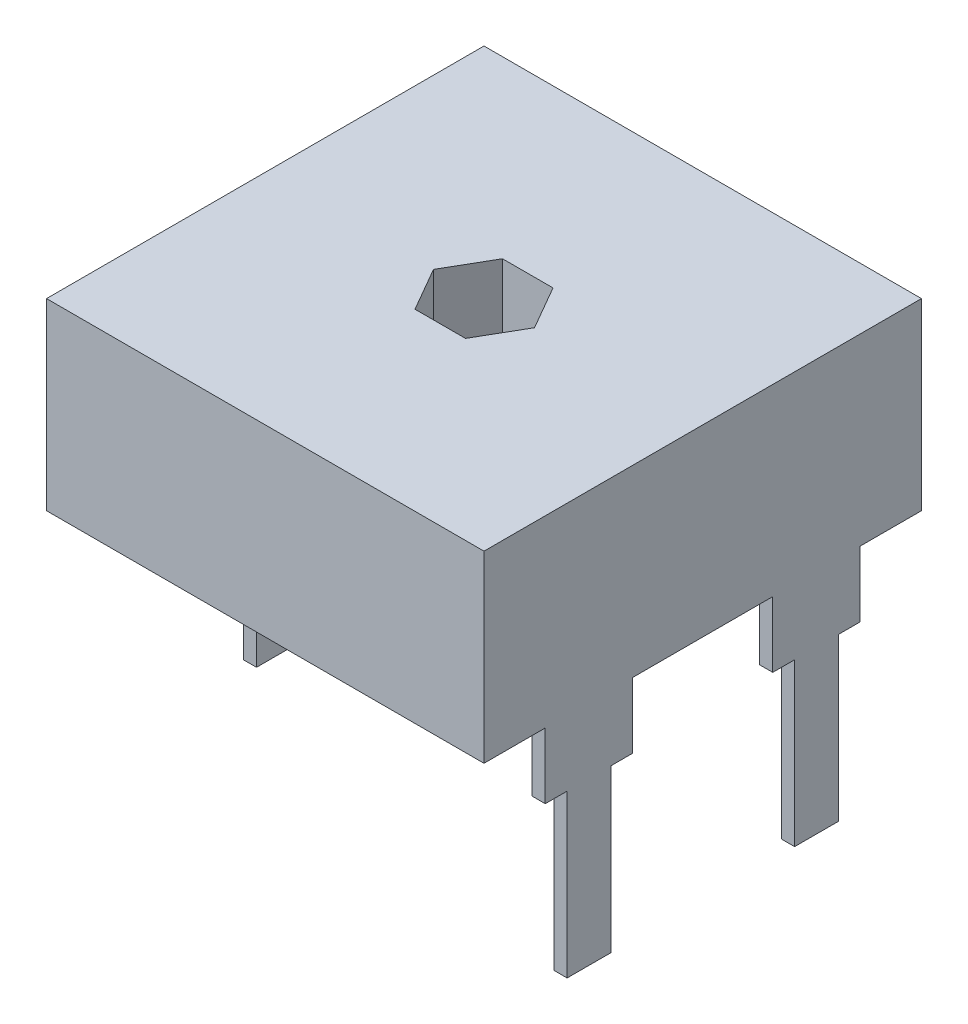
ISO-10303-21;
HEADER;
FILE_DESCRIPTION(('STEP AP214'),'2;1');
FILE_NAME('part.step','',(''),(''),'','','');
FILE_SCHEMA(('AUTOMOTIVE_DESIGN { 1 0 10303 214 1 1 1 1 }'));
ENDSEC;
DATA;
#1=APPLICATION_CONTEXT('core data for automotive mechanical design processes');
#2=APPLICATION_PROTOCOL_DEFINITION('international standard','automotive_design',2000,#1);
#3=PRODUCT_CONTEXT('',#1,'mechanical');
#4=PRODUCT('Part','Part','',(#3));
#5=PRODUCT_RELATED_PRODUCT_CATEGORY('part','',(#4));
#6=PRODUCT_DEFINITION_FORMATION('','',#4);
#7=PRODUCT_DEFINITION_CONTEXT('part definition',#1,'design');
#8=PRODUCT_DEFINITION('design','',#6,#7);
#9=PRODUCT_DEFINITION_SHAPE('','',#8);
#10=(LENGTH_UNIT() NAMED_UNIT(*) SI_UNIT(.MILLI.,.METRE.));
#11=(NAMED_UNIT(*) PLANE_ANGLE_UNIT() SI_UNIT($,.RADIAN.));
#12=(NAMED_UNIT(*) SI_UNIT($,.STERADIAN.) SOLID_ANGLE_UNIT());
#13=UNCERTAINTY_MEASURE_WITH_UNIT(LENGTH_MEASURE(1.E-05),#10,'distance_accuracy_value','');
#14=(GEOMETRIC_REPRESENTATION_CONTEXT(3) GLOBAL_UNCERTAINTY_ASSIGNED_CONTEXT((#13)) GLOBAL_UNIT_ASSIGNED_CONTEXT((#10,
#11,#12)) REPRESENTATION_CONTEXT('',''));
#15=CARTESIAN_POINT('',(0.,0.,0.));
#16=DIRECTION('',(0.,0.,1.));
#17=DIRECTION('',(1.,0.,0.));
#18=AXIS2_PLACEMENT_3D('',#15,#16,#17);
#19=CARTESIAN_POINT('',(0.,-5.7,0.));
#20=DIRECTION('',(0.,-1.,0.));
#21=DIRECTION('',(0.,0.,-1.));
#22=AXIS2_PLACEMENT_3D('',#19,#20,#21);
#23=PLANE('',#22);
#24=DIRECTION('',(-1.,0.,0.));
#25=VECTOR('',#24,1.);
#26=CARTESIAN_POINT('',(-5.,-5.7,0.5));
#27=LINE('',#26,#25);
#28=CARTESIAN_POINT('',(-4.7,-5.7,0.5));
#29=VERTEX_POINT('',#28);
#30=CARTESIAN_POINT('',(-5.,-5.7,0.5));
#31=VERTEX_POINT('',#30);
#32=EDGE_CURVE('E50',#29,#31,#27,.T.);
#33=ORIENTED_EDGE('',*,*,#32,.F.);
#34=DIRECTION('',(0.,0.,1.));
#35=VECTOR('',#34,1.);
#36=CARTESIAN_POINT('',(-4.7,-5.7,1.));
#37=LINE('',#36,#35);
#38=CARTESIAN_POINT('',(-4.7,-5.7,1.));
#39=VERTEX_POINT('',#38);
#40=EDGE_CURVE('E339',#29,#39,#37,.T.);
#41=ORIENTED_EDGE('',*,*,#40,.T.);
#42=DIRECTION('',(-1.,0.,0.));
#43=VECTOR('',#42,1.);
#44=CARTESIAN_POINT('',(-5.,-5.7,1.));
#45=LINE('',#44,#43);
#46=CARTESIAN_POINT('',(-5.,-5.7,1.));
#47=VERTEX_POINT('',#46);
#48=EDGE_CURVE('E342',#39,#47,#45,.T.);
#49=ORIENTED_EDGE('',*,*,#48,.T.);
#50=DIRECTION('',(0.,0.,-1.));
#51=VECTOR('',#50,1.);
#52=CARTESIAN_POINT('',(-5.,-5.7,1.));
#53=LINE('',#52,#51);
#54=EDGE_CURVE('E335',#47,#31,#53,.T.);
#55=ORIENTED_EDGE('',*,*,#54,.T.);
#56=EDGE_LOOP('',(#33,#41,#49,#55));
#57=FACE_BOUND('',#56,.T.);
#58=ADVANCED_FACE('F33',(#57),#23,.T.);
#59=CARTESIAN_POINT('',(0.,-5.7,0.));
#60=DIRECTION('',(0.,-1.,0.));
#61=DIRECTION('',(0.,0.,-1.));
#62=AXIS2_PLACEMENT_3D('',#59,#60,#61);
#63=PLANE('',#62);
#64=DIRECTION('',(0.,0.,1.));
#65=VECTOR('',#64,1.);
#66=CARTESIAN_POINT('',(5.,-5.7,-3.6));
#67=LINE('',#66,#65);
#68=CARTESIAN_POINT('',(5.,-5.7,-3.6));
#69=VERTEX_POINT('',#68);
#70=CARTESIAN_POINT('',(5.,-5.7,-3.1));
#71=VERTEX_POINT('',#70);
#72=EDGE_CURVE('E361',#69,#71,#67,.T.);
#73=ORIENTED_EDGE('',*,*,#72,.T.);
#74=DIRECTION('',(1.,0.,0.));
#75=VECTOR('',#74,1.);
#76=CARTESIAN_POINT('',(4.7,-5.7,-3.1));
#77=LINE('',#76,#75);
#78=CARTESIAN_POINT('',(4.7,-5.7,-3.1));
#79=VERTEX_POINT('',#78);
#80=EDGE_CURVE('E279',#79,#71,#77,.T.);
#81=ORIENTED_EDGE('',*,*,#80,.F.);
#82=DIRECTION('',(0.,0.,-1.));
#83=VECTOR('',#82,1.);
#84=CARTESIAN_POINT('',(4.7,-5.7,-3.6));
#85=LINE('',#84,#83);
#86=CARTESIAN_POINT('',(4.7,-5.7,-3.6));
#87=VERTEX_POINT('',#86);
#88=EDGE_CURVE('E367',#79,#87,#85,.T.);
#89=ORIENTED_EDGE('',*,*,#88,.T.);
#90=DIRECTION('',(1.,0.,0.));
#91=VECTOR('',#90,1.);
#92=CARTESIAN_POINT('',(5.,-5.7,-3.6));
#93=LINE('',#92,#91);
#94=EDGE_CURVE('E371',#87,#69,#93,.T.);
#95=ORIENTED_EDGE('',*,*,#94,.T.);
#96=EDGE_LOOP('',(#73,#81,#89,#95));
#97=FACE_BOUND('',#96,.T.);
#98=ADVANCED_FACE('F582',(#97),#63,.T.);
#99=CARTESIAN_POINT('',(4.7,-5.7,-1.6));
#100=VERTEX_POINT('',#99);
#101=CARTESIAN_POINT('',(4.7,-5.7,-2.1));
#102=VERTEX_POINT('',#101);
#103=EDGE_CURVE('E368',#100,#102,#85,.T.);
#104=ORIENTED_EDGE('',*,*,#103,.T.);
#105=DIRECTION('',(-1.,0.,0.));
#106=VECTOR('',#105,1.);
#107=CARTESIAN_POINT('',(4.7,-5.7,-2.1));
#108=LINE('',#107,#106);
#109=CARTESIAN_POINT('',(5.,-5.7,-2.1));
#110=VERTEX_POINT('',#109);
#111=EDGE_CURVE('E281',#110,#102,#108,.T.);
#112=ORIENTED_EDGE('',*,*,#111,.F.);
#113=CARTESIAN_POINT('',(5.,-5.7,-1.6));
#114=VERTEX_POINT('',#113);
#115=EDGE_CURVE('E365',#110,#114,#67,.T.);
#116=ORIENTED_EDGE('',*,*,#115,.T.);
#117=DIRECTION('',(-1.,0.,0.));
#118=VECTOR('',#117,1.);
#119=CARTESIAN_POINT('',(5.,-5.7,-1.6));
#120=LINE('',#119,#118);
#121=EDGE_CURVE('E364',#114,#100,#120,.T.);
#122=ORIENTED_EDGE('',*,*,#121,.T.);
#123=EDGE_LOOP('',(#104,#112,#116,#122));
#124=FACE_BOUND('',#123,.T.);
#125=ADVANCED_FACE('F567',(#124),#63,.T.);
#126=CARTESIAN_POINT('',(0.,-5.7,0.));
#127=DIRECTION('',(0.,1.,0.));
#128=DIRECTION('',(0.,0.,1.));
#129=AXIS2_PLACEMENT_3D('',#126,#127,#128);
#130=PLANE('',#129);
#131=DIRECTION('',(1.,0.,0.));
#132=VECTOR('',#131,1.);
#133=CARTESIAN_POINT('',(4.7,-5.7,2.1));
#134=LINE('',#133,#132);
#135=CARTESIAN_POINT('',(4.7,-5.7,2.1));
#136=VERTEX_POINT('',#135);
#137=CARTESIAN_POINT('',(5.,-5.7,2.1));
#138=VERTEX_POINT('',#137);
#139=EDGE_CURVE('E307',#136,#138,#134,.T.);
#140=ORIENTED_EDGE('',*,*,#139,.F.);
#141=DIRECTION('',(0.,0.,-1.));
#142=VECTOR('',#141,1.);
#143=CARTESIAN_POINT('',(4.7,-5.7,3.6));
#144=LINE('',#143,#142);
#145=CARTESIAN_POINT('',(4.7,-5.7,1.6));
#146=VERTEX_POINT('',#145);
#147=EDGE_CURVE('E395',#136,#146,#144,.T.);
#148=ORIENTED_EDGE('',*,*,#147,.T.);
#149=DIRECTION('',(1.,0.,0.));
#150=VECTOR('',#149,1.);
#151=CARTESIAN_POINT('',(5.,-5.7,1.6));
#152=LINE('',#151,#150);
#153=CARTESIAN_POINT('',(5.,-5.7,1.6));
#154=VERTEX_POINT('',#153);
#155=EDGE_CURVE('E398',#146,#154,#152,.T.);
#156=ORIENTED_EDGE('',*,*,#155,.T.);
#157=DIRECTION('',(0.,0.,1.));
#158=VECTOR('',#157,1.);
#159=CARTESIAN_POINT('',(5.,-5.7,3.6));
#160=LINE('',#159,#158);
#161=EDGE_CURVE('E390',#154,#138,#160,.T.);
#162=ORIENTED_EDGE('',*,*,#161,.T.);
#163=EDGE_LOOP('',(#140,#148,#156,#162));
#164=FACE_BOUND('',#163,.T.);
#165=ADVANCED_FACE('F544',(#164),#130,.F.);
#166=DIRECTION('',(-1.,0.,0.));
#167=VECTOR('',#166,1.);
#168=CARTESIAN_POINT('',(4.7,-5.7,3.1));
#169=LINE('',#168,#167);
#170=CARTESIAN_POINT('',(5.,-5.7,3.1));
#171=VERTEX_POINT('',#170);
#172=CARTESIAN_POINT('',(4.7,-5.7,3.1));
#173=VERTEX_POINT('',#172);
#174=EDGE_CURVE('E312',#171,#173,#169,.T.);
#175=ORIENTED_EDGE('',*,*,#174,.F.);
#176=CARTESIAN_POINT('',(5.,-5.7,3.6));
#177=VERTEX_POINT('',#176);
#178=EDGE_CURVE('E393',#171,#177,#160,.T.);
#179=ORIENTED_EDGE('',*,*,#178,.T.);
#180=DIRECTION('',(-1.,0.,0.));
#181=VECTOR('',#180,1.);
#182=CARTESIAN_POINT('',(5.,-5.7,3.6));
#183=LINE('',#182,#181);
#184=CARTESIAN_POINT('',(4.7,-5.7,3.6));
#185=VERTEX_POINT('',#184);
#186=EDGE_CURVE('E392',#177,#185,#183,.T.);
#187=ORIENTED_EDGE('',*,*,#186,.T.);
#188=EDGE_CURVE('E396',#185,#173,#144,.T.);
#189=ORIENTED_EDGE('',*,*,#188,.T.);
#190=EDGE_LOOP('',(#175,#179,#187,#189));
#191=FACE_BOUND('',#190,.T.);
#192=ADVANCED_FACE('F528',(#191),#130,.F.);
#193=CARTESIAN_POINT('',(0.,-4.2,0.));
#194=DIRECTION('',(0.,-1.,0.));
#195=DIRECTION('',(0.,0.,-1.));
#196=AXIS2_PLACEMENT_3D('',#193,#194,#195);
#197=PLANE('',#196);
#198=DIRECTION('',(0.5,0.,-0.866025403784439));
#199=VECTOR('',#198,1.);
#200=CARTESIAN_POINT('',(0.577350269189627,-4.2,1.));
#201=LINE('',#200,#199);
#202=CARTESIAN_POINT('',(0.577350269189627,-4.2,1.));
#203=VERTEX_POINT('',#202);
#204=CARTESIAN_POINT('',(1.15470053837925,-4.2,0.));
#205=VERTEX_POINT('',#204);
#206=EDGE_CURVE('E432',#203,#205,#201,.T.);
#207=ORIENTED_EDGE('',*,*,#206,.T.);
#208=DIRECTION('',(-0.5,0.,-0.866025403784439));
#209=VECTOR('',#208,1.);
#210=CARTESIAN_POINT('',(1.15470053837925,-4.2,0.));
#211=LINE('',#210,#209);
#212=CARTESIAN_POINT('',(0.577350269189626,-4.2,-1.));
#213=VERTEX_POINT('',#212);
#214=EDGE_CURVE('E455',#205,#213,#211,.T.);
#215=ORIENTED_EDGE('',*,*,#214,.T.);
#216=DIRECTION('',(-1.,0.,0.));
#217=VECTOR('',#216,1.);
#218=CARTESIAN_POINT('',(0.577350269189626,-4.2,-1.));
#219=LINE('',#218,#217);
#220=CARTESIAN_POINT('',(-0.577350269189626,-4.2,-1.));
#221=VERTEX_POINT('',#220);
#222=EDGE_CURVE('E420',#213,#221,#219,.T.);
#223=ORIENTED_EDGE('',*,*,#222,.T.);
#224=DIRECTION('',(-0.5,0.,0.866025403784439));
#225=VECTOR('',#224,1.);
#226=CARTESIAN_POINT('',(-0.577350269189626,-4.2,-1.));
#227=LINE('',#226,#225);
#228=CARTESIAN_POINT('',(-1.15470053837925,-4.2,0.));
#229=VERTEX_POINT('',#228);
#230=EDGE_CURVE('E423',#221,#229,#227,.T.);
#231=ORIENTED_EDGE('',*,*,#230,.T.);
#232=DIRECTION('',(0.5,0.,0.866025403784439));
#233=VECTOR('',#232,1.);
#234=CARTESIAN_POINT('',(-1.15470053837925,-4.2,0.));
#235=LINE('',#234,#233);
#236=CARTESIAN_POINT('',(-0.577350269189626,-4.2,1.));
#237=VERTEX_POINT('',#236);
#238=EDGE_CURVE('E426',#229,#237,#235,.T.);
#239=ORIENTED_EDGE('',*,*,#238,.T.);
#240=DIRECTION('',(1.,0.,0.));
#241=VECTOR('',#240,1.);
#242=CARTESIAN_POINT('',(-0.577350269189626,-4.2,1.));
#243=LINE('',#242,#241);
#244=EDGE_CURVE('E429',#237,#203,#243,.T.);
#245=ORIENTED_EDGE('',*,*,#244,.T.);
#246=EDGE_LOOP('',(#207,#215,#223,#231,#239,#245));
#247=FACE_BOUND('',#246,.T.);
#248=DIRECTION('',(0.,0.,1.));
#249=VECTOR('',#248,1.);
#250=CARTESIAN_POINT('',(-4.7,-4.2,1.));
#251=LINE('',#250,#249);
#252=CARTESIAN_POINT('',(-4.7,-4.2,-1.));
#253=VERTEX_POINT('',#252);
#254=CARTESIAN_POINT('',(-4.7,-4.2,1.));
#255=VERTEX_POINT('',#254);
#256=EDGE_CURVE('E346',#253,#255,#251,.T.);
#257=ORIENTED_EDGE('',*,*,#256,.F.);
#258=DIRECTION('',(1.,0.,0.));
#259=VECTOR('',#258,1.);
#260=CARTESIAN_POINT('',(-5.,-4.2,-1.));
#261=LINE('',#260,#259);
#262=CARTESIAN_POINT('',(-5.,-4.2,-1.));
#263=VERTEX_POINT('',#262);
#264=EDGE_CURVE('E334',#263,#253,#261,.T.);
#265=ORIENTED_EDGE('',*,*,#264,.F.);
#266=DIRECTION('',(0.,0.,1.));
#267=VECTOR('',#266,1.);
#268=CARTESIAN_POINT('',(-5.,-4.2,5.));
#269=LINE('',#268,#267);
#270=CARTESIAN_POINT('',(-5.,-4.2,-5.));
#271=VERTEX_POINT('',#270);
#272=EDGE_CURVE('E478',#271,#263,#269,.T.);
#273=ORIENTED_EDGE('',*,*,#272,.F.);
#274=DIRECTION('',(-1.,0.,0.));
#275=VECTOR('',#274,1.);
#276=CARTESIAN_POINT('',(-5.,-4.2,-5.));
#277=LINE('',#276,#275);
#278=CARTESIAN_POINT('',(5.,-4.2,-5.));
#279=VERTEX_POINT('',#278);
#280=EDGE_CURVE('E472',#279,#271,#277,.T.);
#281=ORIENTED_EDGE('',*,*,#280,.F.);
#282=DIRECTION('',(0.,0.,-1.));
#283=VECTOR('',#282,1.);
#284=CARTESIAN_POINT('',(5.,-4.2,5.));
#285=LINE('',#284,#283);
#286=CARTESIAN_POINT('',(5.,-4.2,-3.6));
#287=VERTEX_POINT('',#286);
#288=EDGE_CURVE('E474',#287,#279,#285,.T.);
#289=ORIENTED_EDGE('',*,*,#288,.F.);
#290=DIRECTION('',(1.,0.,0.));
#291=VECTOR('',#290,1.);
#292=CARTESIAN_POINT('',(5.,-4.2,-3.6));
#293=LINE('',#292,#291);
#294=CARTESIAN_POINT('',(4.7,-4.2,-3.6));
#295=VERTEX_POINT('',#294);
#296=EDGE_CURVE('E378',#295,#287,#293,.T.);
#297=ORIENTED_EDGE('',*,*,#296,.F.);
#298=DIRECTION('',(0.,0.,-1.));
#299=VECTOR('',#298,1.);
#300=CARTESIAN_POINT('',(4.7,-4.2,-3.6));
#301=LINE('',#300,#299);
#302=CARTESIAN_POINT('',(4.7,-4.2,-1.6));
#303=VERTEX_POINT('',#302);
#304=EDGE_CURVE('E375',#303,#295,#301,.T.);
#305=ORIENTED_EDGE('',*,*,#304,.F.);
#306=DIRECTION('',(-1.,0.,0.));
#307=VECTOR('',#306,1.);
#308=CARTESIAN_POINT('',(5.,-4.2,-1.6));
#309=LINE('',#308,#307);
#310=CARTESIAN_POINT('',(5.,-4.2,-1.6));
#311=VERTEX_POINT('',#310);
#312=EDGE_CURVE('E360',#311,#303,#309,.T.);
#313=ORIENTED_EDGE('',*,*,#312,.F.);
#314=CARTESIAN_POINT('',(5.,-4.2,1.6));
#315=VERTEX_POINT('',#314);
#316=EDGE_CURVE('E473',#315,#311,#285,.T.);
#317=ORIENTED_EDGE('',*,*,#316,.F.);
#318=DIRECTION('',(1.,0.,0.));
#319=VECTOR('',#318,1.);
#320=CARTESIAN_POINT('',(5.,-4.2,1.6));
#321=LINE('',#320,#319);
#322=CARTESIAN_POINT('',(4.7,-4.2,1.6));
#323=VERTEX_POINT('',#322);
#324=EDGE_CURVE('E406',#323,#315,#321,.T.);
#325=ORIENTED_EDGE('',*,*,#324,.F.);
#326=DIRECTION('',(0.,0.,-1.));
#327=VECTOR('',#326,1.);
#328=CARTESIAN_POINT('',(4.7,-4.2,3.6));
#329=LINE('',#328,#327);
#330=CARTESIAN_POINT('',(4.7,-4.2,3.6));
#331=VERTEX_POINT('',#330);
#332=EDGE_CURVE('E403',#331,#323,#329,.T.);
#333=ORIENTED_EDGE('',*,*,#332,.F.);
#334=DIRECTION('',(-1.,0.,0.));
#335=VECTOR('',#334,1.);
#336=CARTESIAN_POINT('',(5.,-4.2,3.6));
#337=LINE('',#336,#335);
#338=CARTESIAN_POINT('',(5.,-4.2,3.6));
#339=VERTEX_POINT('',#338);
#340=EDGE_CURVE('E389',#339,#331,#337,.T.);
#341=ORIENTED_EDGE('',*,*,#340,.F.);
#342=CARTESIAN_POINT('',(5.,-4.2,5.));
#343=VERTEX_POINT('',#342);
#344=EDGE_CURVE('E469',#343,#339,#285,.T.);
#345=ORIENTED_EDGE('',*,*,#344,.F.);
#346=DIRECTION('',(1.,0.,0.));
#347=VECTOR('',#346,1.);
#348=CARTESIAN_POINT('',(-5.,-4.2,5.));
#349=LINE('',#348,#347);
#350=CARTESIAN_POINT('',(-5.,-4.2,5.));
#351=VERTEX_POINT('',#350);
#352=EDGE_CURVE('E481',#351,#343,#349,.T.);
#353=ORIENTED_EDGE('',*,*,#352,.F.);
#354=CARTESIAN_POINT('',(-5.,-4.2,1.));
#355=VERTEX_POINT('',#354);
#356=EDGE_CURVE('E477',#355,#351,#269,.T.);
#357=ORIENTED_EDGE('',*,*,#356,.F.);
#358=DIRECTION('',(-1.,0.,0.));
#359=VECTOR('',#358,1.);
#360=CARTESIAN_POINT('',(-5.,-4.2,1.));
#361=LINE('',#360,#359);
#362=EDGE_CURVE('E348',#255,#355,#361,.T.);
#363=ORIENTED_EDGE('',*,*,#362,.F.);
#364=EDGE_LOOP('',(#257,#265,#273,#281,#289,#297,#305,#313,#317,#325,#333,#341,#345,#353,#357,#363));
#365=FACE_BOUND('',#364,.T.);
#366=ADVANCED_FACE('F515',(#247,#365),#197,.T.);
#367=CARTESIAN_POINT('',(5.,-4.2,5.));
#368=DIRECTION('',(1.,0.,0.));
#369=DIRECTION('',(0.,0.,-1.));
#370=AXIS2_PLACEMENT_3D('',#367,#368,#369);
#371=PLANE('',#370);
#372=DIRECTION('',(0.,0.,-1.));
#373=VECTOR('',#372,1.);
#374=CARTESIAN_POINT('',(5.,0.,5.));
#375=LINE('',#374,#373);
#376=CARTESIAN_POINT('',(5.,0.,5.));
#377=VERTEX_POINT('',#376);
#378=CARTESIAN_POINT('',(5.,0.,-5.));
#379=VERTEX_POINT('',#378);
#380=EDGE_CURVE('E468',#377,#379,#375,.T.);
#381=ORIENTED_EDGE('',*,*,#380,.F.);
#382=DIRECTION('',(0.,1.,0.));
#383=VECTOR('',#382,1.);
#384=CARTESIAN_POINT('',(5.,-4.2,5.));
#385=LINE('',#384,#383);
#386=EDGE_CURVE('E11',#343,#377,#385,.T.);
#387=ORIENTED_EDGE('',*,*,#386,.F.);
#388=ORIENTED_EDGE('',*,*,#344,.T.);
#389=DIRECTION('',(0.,1.,0.));
#390=VECTOR('',#389,1.);
#391=CARTESIAN_POINT('',(5.,-5.7,3.6));
#392=LINE('',#391,#390);
#393=EDGE_CURVE('E417',#177,#339,#392,.T.);
#394=ORIENTED_EDGE('',*,*,#393,.F.);
#395=ORIENTED_EDGE('',*,*,#178,.F.);
#396=DIRECTION('',(0.,1.,0.));
#397=VECTOR('',#396,1.);
#398=CARTESIAN_POINT('',(5.,-9.4,3.1));
#399=LINE('',#398,#397);
#400=CARTESIAN_POINT('',(5.,-9.4,3.1));
#401=VERTEX_POINT('',#400);
#402=EDGE_CURVE('E325',#401,#171,#399,.T.);
#403=ORIENTED_EDGE('',*,*,#402,.F.);
#404=DIRECTION('',(0.,0.,1.));
#405=VECTOR('',#404,1.);
#406=CARTESIAN_POINT('',(5.,-9.4,2.1));
#407=LINE('',#406,#405);
#408=CARTESIAN_POINT('',(5.,-9.4,2.1));
#409=VERTEX_POINT('',#408);
#410=EDGE_CURVE('E314',#409,#401,#407,.T.);
#411=ORIENTED_EDGE('',*,*,#410,.F.);
#412=DIRECTION('',(0.,1.,0.));
#413=VECTOR('',#412,1.);
#414=CARTESIAN_POINT('',(5.,-9.4,2.1));
#415=LINE('',#414,#413);
#416=EDGE_CURVE('E328',#409,#138,#415,.T.);
#417=ORIENTED_EDGE('',*,*,#416,.T.);
#418=ORIENTED_EDGE('',*,*,#161,.F.);
#419=DIRECTION('',(0.,1.,0.));
#420=VECTOR('',#419,1.);
#421=CARTESIAN_POINT('',(5.,-5.7,1.6));
#422=LINE('',#421,#420);
#423=EDGE_CURVE('E400',#154,#315,#422,.T.);
#424=ORIENTED_EDGE('',*,*,#423,.T.);
#425=ORIENTED_EDGE('',*,*,#316,.T.);
#426=DIRECTION('',(0.,1.,0.));
#427=VECTOR('',#426,1.);
#428=CARTESIAN_POINT('',(5.,-5.7,-1.6));
#429=LINE('',#428,#427);
#430=EDGE_CURVE('E387',#114,#311,#429,.T.);
#431=ORIENTED_EDGE('',*,*,#430,.F.);
#432=ORIENTED_EDGE('',*,*,#115,.F.);
#433=DIRECTION('',(0.,1.,0.));
#434=VECTOR('',#433,1.);
#435=CARTESIAN_POINT('',(5.,-9.4,-2.1));
#436=LINE('',#435,#434);
#437=CARTESIAN_POINT('',(5.,-9.4,-2.1));
#438=VERTEX_POINT('',#437);
#439=EDGE_CURVE('E300',#438,#110,#436,.T.);
#440=ORIENTED_EDGE('',*,*,#439,.F.);
#441=DIRECTION('',(0.,0.,1.));
#442=VECTOR('',#441,1.);
#443=CARTESIAN_POINT('',(5.,-9.4,-3.1));
#444=LINE('',#443,#442);
#445=CARTESIAN_POINT('',(5.,-9.4,-3.1));
#446=VERTEX_POINT('',#445);
#447=EDGE_CURVE('E292',#446,#438,#444,.T.);
#448=ORIENTED_EDGE('',*,*,#447,.F.);
#449=DIRECTION('',(0.,1.,0.));
#450=VECTOR('',#449,1.);
#451=CARTESIAN_POINT('',(5.,-9.4,-3.1));
#452=LINE('',#451,#450);
#453=EDGE_CURVE('E302',#446,#71,#452,.T.);
#454=ORIENTED_EDGE('',*,*,#453,.T.);
#455=ORIENTED_EDGE('',*,*,#72,.F.);
#456=DIRECTION('',(0.,1.,0.));
#457=VECTOR('',#456,1.);
#458=CARTESIAN_POINT('',(5.,-5.7,-3.6));
#459=LINE('',#458,#457);
#460=EDGE_CURVE('E373',#69,#287,#459,.T.);
#461=ORIENTED_EDGE('',*,*,#460,.T.);
#462=ORIENTED_EDGE('',*,*,#288,.T.);
#463=DIRECTION('',(0.,1.,0.));
#464=VECTOR('',#463,1.);
#465=CARTESIAN_POINT('',(5.,-4.2,-5.));
#466=LINE('',#465,#464);
#467=EDGE_CURVE('E37',#279,#379,#466,.T.);
#468=ORIENTED_EDGE('',*,*,#467,.T.);
#469=EDGE_LOOP('',(#381,#387,#388,#394,#395,#403,#411,#417,#418,#424,#425,#431,#432,#440,#448,
#454,#455,#461,#462,#468));
#470=FACE_BOUND('',#469,.T.);
#471=ADVANCED_FACE('F35',(#470),#371,.T.);
#472=CARTESIAN_POINT('',(-5.,-4.2,5.));
#473=DIRECTION('',(0.,0.,1.));
#474=DIRECTION('',(1.,0.,0.));
#475=AXIS2_PLACEMENT_3D('',#472,#473,#474);
#476=PLANE('',#475);
#477=DIRECTION('',(1.,0.,0.));
#478=VECTOR('',#477,1.);
#479=CARTESIAN_POINT('',(-5.,0.,5.));
#480=LINE('',#479,#478);
#481=CARTESIAN_POINT('',(-5.,0.,5.));
#482=VERTEX_POINT('',#481);
#483=EDGE_CURVE('E492',#482,#377,#480,.T.);
#484=ORIENTED_EDGE('',*,*,#483,.F.);
#485=DIRECTION('',(0.,1.,0.));
#486=VECTOR('',#485,1.);
#487=CARTESIAN_POINT('',(-5.,-4.2,5.));
#488=LINE('',#487,#486);
#489=EDGE_CURVE('E42',#351,#482,#488,.T.);
#490=ORIENTED_EDGE('',*,*,#489,.F.);
#491=ORIENTED_EDGE('',*,*,#352,.T.);
#492=ORIENTED_EDGE('',*,*,#386,.T.);
#493=EDGE_LOOP('',(#484,#490,#491,#492));
#494=FACE_BOUND('',#493,.T.);
#495=ADVANCED_FACE('F509',(#494),#476,.T.);
#496=CARTESIAN_POINT('',(-5.,-4.2,5.));
#497=DIRECTION('',(-1.,0.,0.));
#498=DIRECTION('',(0.,0.,1.));
#499=AXIS2_PLACEMENT_3D('',#496,#497,#498);
#500=PLANE('',#499);
#501=DIRECTION('',(0.,0.,1.));
#502=VECTOR('',#501,1.);
#503=CARTESIAN_POINT('',(-5.,0.,5.));
#504=LINE('',#503,#502);
#505=CARTESIAN_POINT('',(-5.,0.,-5.));
#506=VERTEX_POINT('',#505);
#507=EDGE_CURVE('E489',#506,#482,#504,.T.);
#508=ORIENTED_EDGE('',*,*,#507,.F.);
#509=DIRECTION('',(0.,1.,0.));
#510=VECTOR('',#509,1.);
#511=CARTESIAN_POINT('',(-5.,-4.2,-5.));
#512=LINE('',#511,#510);
#513=EDGE_CURVE('E495',#271,#506,#512,.T.);
#514=ORIENTED_EDGE('',*,*,#513,.F.);
#515=ORIENTED_EDGE('',*,*,#272,.T.);
#516=DIRECTION('',(0.,1.,0.));
#517=VECTOR('',#516,1.);
#518=CARTESIAN_POINT('',(-5.,-5.7,-1.));
#519=LINE('',#518,#517);
#520=CARTESIAN_POINT('',(-5.,-5.7,-1.));
#521=VERTEX_POINT('',#520);
#522=EDGE_CURVE('E358',#521,#263,#519,.T.);
#523=ORIENTED_EDGE('',*,*,#522,.F.);
#524=CARTESIAN_POINT('',(-5.,-5.7,-0.5));
#525=VERTEX_POINT('',#524);
#526=EDGE_CURVE('E278',#525,#521,#53,.T.);
#527=ORIENTED_EDGE('',*,*,#526,.F.);
#528=DIRECTION('',(0.,1.,0.));
#529=VECTOR('',#528,1.);
#530=CARTESIAN_POINT('',(-5.,-9.4,-0.5));
#531=LINE('',#530,#529);
#532=CARTESIAN_POINT('',(-5.,-9.4,-0.5));
#533=VERTEX_POINT('',#532);
#534=EDGE_CURVE('E259',#533,#525,#531,.T.);
#535=ORIENTED_EDGE('',*,*,#534,.F.);
#536=DIRECTION('',(0.,0.,-1.));
#537=VECTOR('',#536,1.);
#538=CARTESIAN_POINT('',(-5.,-9.4,-0.5));
#539=LINE('',#538,#537);
#540=CARTESIAN_POINT('',(-5.,-9.4,0.5));
#541=VERTEX_POINT('',#540);
#542=EDGE_CURVE('E265',#541,#533,#539,.T.);
#543=ORIENTED_EDGE('',*,*,#542,.F.);
#544=DIRECTION('',(0.,1.,0.));
#545=VECTOR('',#544,1.);
#546=CARTESIAN_POINT('',(-5.,-9.4,0.5));
#547=LINE('',#546,#545);
#548=EDGE_CURVE('E609',#541,#31,#547,.T.);
#549=ORIENTED_EDGE('',*,*,#548,.T.);
#550=ORIENTED_EDGE('',*,*,#54,.F.);
#551=DIRECTION('',(0.,1.,0.));
#552=VECTOR('',#551,1.);
#553=CARTESIAN_POINT('',(-5.,-5.7,1.));
#554=LINE('',#553,#552);
#555=EDGE_CURVE('E344',#47,#355,#554,.T.);
#556=ORIENTED_EDGE('',*,*,#555,.T.);
#557=ORIENTED_EDGE('',*,*,#356,.T.);
#558=ORIENTED_EDGE('',*,*,#489,.T.);
#559=EDGE_LOOP('',(#508,#514,#515,#523,#527,#535,#543,#549,#550,#556,#557,#558));
#560=FACE_BOUND('',#559,.T.);
#561=ADVANCED_FACE('F276',(#560),#500,.T.);
#562=CARTESIAN_POINT('',(-5.,-4.2,-5.));
#563=DIRECTION('',(0.,0.,-1.));
#564=DIRECTION('',(-1.,0.,0.));
#565=AXIS2_PLACEMENT_3D('',#562,#563,#564);
#566=PLANE('',#565);
#567=DIRECTION('',(-1.,0.,0.));
#568=VECTOR('',#567,1.);
#569=CARTESIAN_POINT('',(-5.,0.,-5.));
#570=LINE('',#569,#568);
#571=EDGE_CURVE('E486',#379,#506,#570,.T.);
#572=ORIENTED_EDGE('',*,*,#571,.F.);
#573=ORIENTED_EDGE('',*,*,#467,.F.);
#574=ORIENTED_EDGE('',*,*,#280,.T.);
#575=ORIENTED_EDGE('',*,*,#513,.T.);
#576=EDGE_LOOP('',(#572,#573,#574,#575));
#577=FACE_BOUND('',#576,.T.);
#578=ADVANCED_FACE('F503',(#577),#566,.T.);
#579=CARTESIAN_POINT('',(0.,0.,0.));
#580=DIRECTION('',(0.,-1.,0.));
#581=DIRECTION('',(0.,0.,-1.));
#582=AXIS2_PLACEMENT_3D('',#579,#580,#581);
#583=PLANE('',#582);
#584=DIRECTION('',(-0.5,0.,-0.866025403784438));
#585=VECTOR('',#584,1.);
#586=CARTESIAN_POINT('',(1.15470053837925,0.,0.));
#587=LINE('',#586,#585);
#588=CARTESIAN_POINT('',(1.15470053837925,0.,0.));
#589=VERTEX_POINT('',#588);
#590=CARTESIAN_POINT('',(0.577350269189626,0.,-1.));
#591=VERTEX_POINT('',#590);
#592=EDGE_CURVE('E437',#589,#591,#587,.T.);
#593=ORIENTED_EDGE('',*,*,#592,.F.);
#594=DIRECTION('',(0.5,0.,-0.866025403784438));
#595=VECTOR('',#594,1.);
#596=CARTESIAN_POINT('',(0.577350269189627,0.,1.));
#597=LINE('',#596,#595);
#598=CARTESIAN_POINT('',(0.577350269189627,0.,1.));
#599=VERTEX_POINT('',#598);
#600=EDGE_CURVE('E435',#599,#589,#597,.T.);
#601=ORIENTED_EDGE('',*,*,#600,.F.);
#602=DIRECTION('',(1.,0.,0.));
#603=VECTOR('',#602,1.);
#604=CARTESIAN_POINT('',(-0.577350269189626,0.,1.));
#605=LINE('',#604,#603);
#606=CARTESIAN_POINT('',(-0.577350269189626,0.,1.));
#607=VERTEX_POINT('',#606);
#608=EDGE_CURVE('E449',#607,#599,#605,.T.);
#609=ORIENTED_EDGE('',*,*,#608,.F.);
#610=DIRECTION('',(0.5,0.,0.866025403784438));
#611=VECTOR('',#610,1.);
#612=CARTESIAN_POINT('',(-1.15470053837925,0.,0.));
#613=LINE('',#612,#611);
#614=CARTESIAN_POINT('',(-1.15470053837925,0.,0.));
#615=VERTEX_POINT('',#614);
#616=EDGE_CURVE('E446',#615,#607,#613,.T.);
#617=ORIENTED_EDGE('',*,*,#616,.F.);
#618=DIRECTION('',(-0.5,0.,0.866025403784439));
#619=VECTOR('',#618,1.);
#620=CARTESIAN_POINT('',(-0.577350269189626,0.,-1.));
#621=LINE('',#620,#619);
#622=CARTESIAN_POINT('',(-0.577350269189626,0.,-1.));
#623=VERTEX_POINT('',#622);
#624=EDGE_CURVE('E443',#623,#615,#621,.T.);
#625=ORIENTED_EDGE('',*,*,#624,.F.);
#626=DIRECTION('',(-1.,0.,0.));
#627=VECTOR('',#626,1.);
#628=CARTESIAN_POINT('',(0.577350269189626,0.,-1.));
#629=LINE('',#628,#627);
#630=EDGE_CURVE('E440',#591,#623,#629,.T.);
#631=ORIENTED_EDGE('',*,*,#630,.F.);
#632=EDGE_LOOP('',(#593,#601,#609,#617,#625,#631));
#633=FACE_BOUND('',#632,.T.);
#634=ORIENTED_EDGE('',*,*,#380,.T.);
#635=ORIENTED_EDGE('',*,*,#571,.T.);
#636=ORIENTED_EDGE('',*,*,#507,.T.);
#637=ORIENTED_EDGE('',*,*,#483,.T.);
#638=EDGE_LOOP('',(#634,#635,#636,#637));
#639=FACE_BOUND('',#638,.T.);
#640=ADVANCED_FACE('F505',(#633,#639),#583,.F.);
#641=CARTESIAN_POINT('',(0.577350269189627,-4.201,1.));
#642=DIRECTION('',(0.866025403784439,0.,0.5));
#643=DIRECTION('',(0.5,0.,-0.866025403784439));
#644=AXIS2_PLACEMENT_3D('',#641,#642,#643);
#645=PLANE('',#644);
#646=DIRECTION('',(0.,1.,0.));
#647=VECTOR('',#646,1.);
#648=CARTESIAN_POINT('',(0.577350269189627,-4.201,1.));
#649=LINE('',#648,#647);
#650=EDGE_CURVE('E453',#203,#599,#649,.T.);
#651=ORIENTED_EDGE('',*,*,#650,.T.);
#652=ORIENTED_EDGE('',*,*,#600,.T.);
#653=DIRECTION('',(0.,1.,0.));
#654=VECTOR('',#653,1.);
#655=CARTESIAN_POINT('',(1.15470053837925,-4.201,0.));
#656=LINE('',#655,#654);
#657=EDGE_CURVE('E452',#205,#589,#656,.T.);
#658=ORIENTED_EDGE('',*,*,#657,.F.);
#659=ORIENTED_EDGE('',*,*,#206,.F.);
#660=EDGE_LOOP('',(#651,#652,#658,#659));
#661=FACE_BOUND('',#660,.T.);
#662=ADVANCED_FACE('F654',(#661),#645,.F.);
#663=CARTESIAN_POINT('',(-0.577350269189626,-4.201,1.));
#664=DIRECTION('',(0.,0.,1.));
#665=DIRECTION('',(1.,0.,0.));
#666=AXIS2_PLACEMENT_3D('',#663,#664,#665);
#667=PLANE('',#666);
#668=DIRECTION('',(0.,1.,0.));
#669=VECTOR('',#668,1.);
#670=CARTESIAN_POINT('',(-0.577350269189626,-4.201,1.));
#671=LINE('',#670,#669);
#672=EDGE_CURVE('E456',#237,#607,#671,.T.);
#673=ORIENTED_EDGE('',*,*,#672,.T.);
#674=ORIENTED_EDGE('',*,*,#608,.T.);
#675=ORIENTED_EDGE('',*,*,#650,.F.);
#676=ORIENTED_EDGE('',*,*,#244,.F.);
#677=EDGE_LOOP('',(#673,#674,#675,#676));
#678=FACE_BOUND('',#677,.T.);
#679=ADVANCED_FACE('F650',(#678),#667,.F.);
#680=CARTESIAN_POINT('',(-1.15470053837925,-4.201,0.));
#681=DIRECTION('',(-0.866025403784438,0.,0.5));
#682=DIRECTION('',(0.5,0.,0.866025403784439));
#683=AXIS2_PLACEMENT_3D('',#680,#681,#682);
#684=PLANE('',#683);
#685=DIRECTION('',(0.,1.,0.));
#686=VECTOR('',#685,1.);
#687=CARTESIAN_POINT('',(-1.15470053837925,-4.201,0.));
#688=LINE('',#687,#686);
#689=EDGE_CURVE('E458',#229,#615,#688,.T.);
#690=ORIENTED_EDGE('',*,*,#689,.T.);
#691=ORIENTED_EDGE('',*,*,#616,.T.);
#692=ORIENTED_EDGE('',*,*,#672,.F.);
#693=ORIENTED_EDGE('',*,*,#238,.F.);
#694=EDGE_LOOP('',(#690,#691,#692,#693));
#695=FACE_BOUND('',#694,.T.);
#696=ADVANCED_FACE('F653',(#695),#684,.F.);
#697=CARTESIAN_POINT('',(-0.577350269189626,-4.201,-1.));
#698=DIRECTION('',(-0.866025403784439,0.,-0.5));
#699=DIRECTION('',(-0.5,0.,0.866025403784439));
#700=AXIS2_PLACEMENT_3D('',#697,#698,#699);
#701=PLANE('',#700);
#702=DIRECTION('',(0.,1.,0.));
#703=VECTOR('',#702,1.);
#704=CARTESIAN_POINT('',(-0.577350269189626,-4.201,-1.));
#705=LINE('',#704,#703);
#706=EDGE_CURVE('E460',#221,#623,#705,.T.);
#707=ORIENTED_EDGE('',*,*,#706,.T.);
#708=ORIENTED_EDGE('',*,*,#624,.T.);
#709=ORIENTED_EDGE('',*,*,#689,.F.);
#710=ORIENTED_EDGE('',*,*,#230,.F.);
#711=EDGE_LOOP('',(#707,#708,#709,#710));
#712=FACE_BOUND('',#711,.T.);
#713=ADVANCED_FACE('F658',(#712),#701,.F.);
#714=CARTESIAN_POINT('',(0.577350269189626,-4.201,-1.));
#715=DIRECTION('',(0.,0.,-1.));
#716=DIRECTION('',(-1.,0.,0.));
#717=AXIS2_PLACEMENT_3D('',#714,#715,#716);
#718=PLANE('',#717);
#719=DIRECTION('',(0.,1.,0.));
#720=VECTOR('',#719,1.);
#721=CARTESIAN_POINT('',(0.577350269189626,-4.201,-1.));
#722=LINE('',#721,#720);
#723=EDGE_CURVE('E462',#213,#591,#722,.T.);
#724=ORIENTED_EDGE('',*,*,#723,.T.);
#725=ORIENTED_EDGE('',*,*,#630,.T.);
#726=ORIENTED_EDGE('',*,*,#706,.F.);
#727=ORIENTED_EDGE('',*,*,#222,.F.);
#728=EDGE_LOOP('',(#724,#725,#726,#727));
#729=FACE_BOUND('',#728,.T.);
#730=ADVANCED_FACE('F662',(#729),#718,.F.);
#731=CARTESIAN_POINT('',(1.15470053837925,-4.201,0.));
#732=DIRECTION('',(0.866025403784439,0.,-0.5));
#733=DIRECTION('',(-0.5,0.,-0.866025403784439));
#734=AXIS2_PLACEMENT_3D('',#731,#732,#733);
#735=PLANE('',#734);
#736=ORIENTED_EDGE('',*,*,#657,.T.);
#737=ORIENTED_EDGE('',*,*,#592,.T.);
#738=ORIENTED_EDGE('',*,*,#723,.F.);
#739=ORIENTED_EDGE('',*,*,#214,.F.);
#740=EDGE_LOOP('',(#736,#737,#738,#739));
#741=FACE_BOUND('',#740,.T.);
#742=ADVANCED_FACE('F649',(#741),#735,.F.);
#743=CARTESIAN_POINT('',(5.,-5.7,3.6));
#744=DIRECTION('',(0.,0.,-1.));
#745=DIRECTION('',(-1.,0.,0.));
#746=AXIS2_PLACEMENT_3D('',#743,#744,#745);
#747=PLANE('',#746);
#748=ORIENTED_EDGE('',*,*,#340,.T.);
#749=DIRECTION('',(0.,1.,0.));
#750=VECTOR('',#749,1.);
#751=CARTESIAN_POINT('',(4.7,-5.7,3.6));
#752=LINE('',#751,#750);
#753=EDGE_CURVE('E414',#185,#331,#752,.T.);
#754=ORIENTED_EDGE('',*,*,#753,.F.);
#755=ORIENTED_EDGE('',*,*,#186,.F.);
#756=ORIENTED_EDGE('',*,*,#393,.T.);
#757=EDGE_LOOP('',(#748,#754,#755,#756));
#758=FACE_BOUND('',#757,.T.);
#759=ADVANCED_FACE('F519',(#758),#747,.F.);
#760=CARTESIAN_POINT('',(4.7,-5.7,3.6));
#761=DIRECTION('',(1.,0.,0.));
#762=DIRECTION('',(0.,0.,-1.));
#763=AXIS2_PLACEMENT_3D('',#760,#761,#762);
#764=PLANE('',#763);
#765=ORIENTED_EDGE('',*,*,#332,.T.);
#766=DIRECTION('',(0.,1.,0.));
#767=VECTOR('',#766,1.);
#768=CARTESIAN_POINT('',(4.7,-5.7,1.6));
#769=LINE('',#768,#767);
#770=EDGE_CURVE('E411',#146,#323,#769,.T.);
#771=ORIENTED_EDGE('',*,*,#770,.F.);
#772=ORIENTED_EDGE('',*,*,#147,.F.);
#773=DIRECTION('',(0.,1.,0.));
#774=VECTOR('',#773,1.);
#775=CARTESIAN_POINT('',(4.7,-9.4,2.1));
#776=LINE('',#775,#774);
#777=CARTESIAN_POINT('',(4.7,-9.4,2.1));
#778=VERTEX_POINT('',#777);
#779=EDGE_CURVE('E331',#778,#136,#776,.T.);
#780=ORIENTED_EDGE('',*,*,#779,.F.);
#781=DIRECTION('',(0.,0.,-1.));
#782=VECTOR('',#781,1.);
#783=CARTESIAN_POINT('',(4.7,-9.4,2.1));
#784=LINE('',#783,#782);
#785=CARTESIAN_POINT('',(4.7,-9.4,3.1));
#786=VERTEX_POINT('',#785);
#787=EDGE_CURVE('E308',#786,#778,#784,.T.);
#788=ORIENTED_EDGE('',*,*,#787,.F.);
#789=DIRECTION('',(0.,1.,0.));
#790=VECTOR('',#789,1.);
#791=CARTESIAN_POINT('',(4.7,-9.4,3.1));
#792=LINE('',#791,#790);
#793=EDGE_CURVE('E318',#786,#173,#792,.T.);
#794=ORIENTED_EDGE('',*,*,#793,.T.);
#795=ORIENTED_EDGE('',*,*,#188,.F.);
#796=ORIENTED_EDGE('',*,*,#753,.T.);
#797=EDGE_LOOP('',(#765,#771,#772,#780,#788,#794,#795,#796));
#798=FACE_BOUND('',#797,.T.);
#799=ADVANCED_FACE('F523',(#798),#764,.F.);
#800=CARTESIAN_POINT('',(5.,-5.7,1.6));
#801=DIRECTION('',(0.,0.,1.));
#802=DIRECTION('',(1.,0.,0.));
#803=AXIS2_PLACEMENT_3D('',#800,#801,#802);
#804=PLANE('',#803);
#805=ORIENTED_EDGE('',*,*,#324,.T.);
#806=ORIENTED_EDGE('',*,*,#423,.F.);
#807=ORIENTED_EDGE('',*,*,#155,.F.);
#808=ORIENTED_EDGE('',*,*,#770,.T.);
#809=EDGE_LOOP('',(#805,#806,#807,#808));
#810=FACE_BOUND('',#809,.T.);
#811=ADVANCED_FACE('F548',(#810),#804,.F.);
#812=CARTESIAN_POINT('',(5.,-5.7,-1.6));
#813=DIRECTION('',(0.,0.,-1.));
#814=DIRECTION('',(-1.,0.,0.));
#815=AXIS2_PLACEMENT_3D('',#812,#813,#814);
#816=PLANE('',#815);
#817=ORIENTED_EDGE('',*,*,#312,.T.);
#818=DIRECTION('',(0.,1.,0.));
#819=VECTOR('',#818,1.);
#820=CARTESIAN_POINT('',(4.7,-5.7,-1.6));
#821=LINE('',#820,#819);
#822=EDGE_CURVE('E384',#100,#303,#821,.T.);
#823=ORIENTED_EDGE('',*,*,#822,.F.);
#824=ORIENTED_EDGE('',*,*,#121,.F.);
#825=ORIENTED_EDGE('',*,*,#430,.T.);
#826=EDGE_LOOP('',(#817,#823,#824,#825));
#827=FACE_BOUND('',#826,.T.);
#828=ADVANCED_FACE('F557',(#827),#816,.F.);
#829=CARTESIAN_POINT('',(4.7,-5.7,-3.6));
#830=DIRECTION('',(1.,0.,0.));
#831=DIRECTION('',(0.,0.,-1.));
#832=AXIS2_PLACEMENT_3D('',#829,#830,#831);
#833=PLANE('',#832);
#834=ORIENTED_EDGE('',*,*,#304,.T.);
#835=DIRECTION('',(0.,1.,0.));
#836=VECTOR('',#835,1.);
#837=CARTESIAN_POINT('',(4.7,-5.7,-3.6));
#838=LINE('',#837,#836);
#839=EDGE_CURVE('E382',#87,#295,#838,.T.);
#840=ORIENTED_EDGE('',*,*,#839,.F.);
#841=ORIENTED_EDGE('',*,*,#88,.F.);
#842=DIRECTION('',(0.,1.,0.));
#843=VECTOR('',#842,1.);
#844=CARTESIAN_POINT('',(4.7,-9.4,-3.1));
#845=LINE('',#844,#843);
#846=CARTESIAN_POINT('',(4.7,-9.4,-3.1));
#847=VERTEX_POINT('',#846);
#848=EDGE_CURVE('E305',#847,#79,#845,.T.);
#849=ORIENTED_EDGE('',*,*,#848,.F.);
#850=DIRECTION('',(0.,0.,-1.));
#851=VECTOR('',#850,1.);
#852=CARTESIAN_POINT('',(4.7,-9.4,-3.1));
#853=LINE('',#852,#851);
#854=CARTESIAN_POINT('',(4.7,-9.4,-2.1));
#855=VERTEX_POINT('',#854);
#856=EDGE_CURVE('E287',#855,#847,#853,.T.);
#857=ORIENTED_EDGE('',*,*,#856,.F.);
#858=DIRECTION('',(0.,1.,0.));
#859=VECTOR('',#858,1.);
#860=CARTESIAN_POINT('',(4.7,-9.4,-2.1));
#861=LINE('',#860,#859);
#862=EDGE_CURVE('E295',#855,#102,#861,.T.);
#863=ORIENTED_EDGE('',*,*,#862,.T.);
#864=ORIENTED_EDGE('',*,*,#103,.F.);
#865=ORIENTED_EDGE('',*,*,#822,.T.);
#866=EDGE_LOOP('',(#834,#840,#841,#849,#857,#863,#864,#865));
#867=FACE_BOUND('',#866,.T.);
#868=ADVANCED_FACE('F561',(#867),#833,.F.);
#869=CARTESIAN_POINT('',(5.,-5.7,-3.6));
#870=DIRECTION('',(0.,0.,1.));
#871=DIRECTION('',(1.,0.,0.));
#872=AXIS2_PLACEMENT_3D('',#869,#870,#871);
#873=PLANE('',#872);
#874=ORIENTED_EDGE('',*,*,#296,.T.);
#875=ORIENTED_EDGE('',*,*,#460,.F.);
#876=ORIENTED_EDGE('',*,*,#94,.F.);
#877=ORIENTED_EDGE('',*,*,#839,.T.);
#878=EDGE_LOOP('',(#874,#875,#876,#877));
#879=FACE_BOUND('',#878,.T.);
#880=ADVANCED_FACE('F587',(#879),#873,.F.);
#881=CARTESIAN_POINT('',(-5.,-5.7,-1.));
#882=DIRECTION('',(0.,0.,1.));
#883=DIRECTION('',(1.,0.,0.));
#884=AXIS2_PLACEMENT_3D('',#881,#882,#883);
#885=PLANE('',#884);
#886=ORIENTED_EDGE('',*,*,#264,.T.);
#887=DIRECTION('',(0.,1.,0.));
#888=VECTOR('',#887,1.);
#889=CARTESIAN_POINT('',(-4.7,-5.7,-1.));
#890=LINE('',#889,#888);
#891=CARTESIAN_POINT('',(-4.7,-5.7,-1.));
#892=VERTEX_POINT('',#891);
#893=EDGE_CURVE('E355',#892,#253,#890,.T.);
#894=ORIENTED_EDGE('',*,*,#893,.F.);
#895=DIRECTION('',(1.,0.,0.));
#896=VECTOR('',#895,1.);
#897=CARTESIAN_POINT('',(-5.,-5.7,-1.));
#898=LINE('',#897,#896);
#899=EDGE_CURVE('E337',#521,#892,#898,.T.);
#900=ORIENTED_EDGE('',*,*,#899,.F.);
#901=ORIENTED_EDGE('',*,*,#522,.T.);
#902=EDGE_LOOP('',(#886,#894,#900,#901));
#903=FACE_BOUND('',#902,.T.);
#904=ADVANCED_FACE('F605',(#903),#885,.F.);
#905=CARTESIAN_POINT('',(-4.7,-5.7,1.));
#906=DIRECTION('',(-1.,0.,0.));
#907=DIRECTION('',(0.,0.,1.));
#908=AXIS2_PLACEMENT_3D('',#905,#906,#907);
#909=PLANE('',#908);
#910=ORIENTED_EDGE('',*,*,#256,.T.);
#911=DIRECTION('',(0.,1.,0.));
#912=VECTOR('',#911,1.);
#913=CARTESIAN_POINT('',(-4.7,-5.7,1.));
#914=LINE('',#913,#912);
#915=EDGE_CURVE('E352',#39,#255,#914,.T.);
#916=ORIENTED_EDGE('',*,*,#915,.F.);
#917=ORIENTED_EDGE('',*,*,#40,.F.);
#918=DIRECTION('',(0.,1.,0.));
#919=VECTOR('',#918,1.);
#920=CARTESIAN_POINT('',(-4.7,-9.4,0.5));
#921=LINE('',#920,#919);
#922=CARTESIAN_POINT('',(-4.7,-9.4,0.5));
#923=VERTEX_POINT('',#922);
#924=EDGE_CURVE('E283',#923,#29,#921,.T.);
#925=ORIENTED_EDGE('',*,*,#924,.F.);
#926=DIRECTION('',(0.,0.,1.));
#927=VECTOR('',#926,1.);
#928=CARTESIAN_POINT('',(-4.7,-9.4,-0.5));
#929=LINE('',#928,#927);
#930=CARTESIAN_POINT('',(-4.7,-9.4,-0.5));
#931=VERTEX_POINT('',#930);
#932=EDGE_CURVE('E264',#931,#923,#929,.T.);
#933=ORIENTED_EDGE('',*,*,#932,.F.);
#934=DIRECTION('',(0.,1.,0.));
#935=VECTOR('',#934,1.);
#936=CARTESIAN_POINT('',(-4.7,-9.4,-0.5));
#937=LINE('',#936,#935);
#938=CARTESIAN_POINT('',(-4.7,-5.7,-0.5));
#939=VERTEX_POINT('',#938);
#940=EDGE_CURVE('E261',#931,#939,#937,.T.);
#941=ORIENTED_EDGE('',*,*,#940,.T.);
#942=EDGE_CURVE('E340',#892,#939,#37,.T.);
#943=ORIENTED_EDGE('',*,*,#942,.F.);
#944=ORIENTED_EDGE('',*,*,#893,.T.);
#945=EDGE_LOOP('',(#910,#916,#917,#925,#933,#941,#943,#944));
#946=FACE_BOUND('',#945,.T.);
#947=ADVANCED_FACE('F598',(#946),#909,.F.);
#948=CARTESIAN_POINT('',(-5.,-5.7,1.));
#949=DIRECTION('',(0.,0.,-1.));
#950=DIRECTION('',(-1.,0.,0.));
#951=AXIS2_PLACEMENT_3D('',#948,#949,#950);
#952=PLANE('',#951);
#953=ORIENTED_EDGE('',*,*,#362,.T.);
#954=ORIENTED_EDGE('',*,*,#555,.F.);
#955=ORIENTED_EDGE('',*,*,#48,.F.);
#956=ORIENTED_EDGE('',*,*,#915,.T.);
#957=EDGE_LOOP('',(#953,#954,#955,#956));
#958=FACE_BOUND('',#957,.T.);
#959=ADVANCED_FACE('F594',(#958),#952,.F.);
#960=DIRECTION('',(1.,0.,0.));
#961=VECTOR('',#960,1.);
#962=CARTESIAN_POINT('',(-5.,-5.7,-0.5));
#963=LINE('',#962,#961);
#964=EDGE_CURVE('E58',#525,#939,#963,.T.);
#965=ORIENTED_EDGE('',*,*,#964,.F.);
#966=ORIENTED_EDGE('',*,*,#526,.T.);
#967=ORIENTED_EDGE('',*,*,#899,.T.);
#968=ORIENTED_EDGE('',*,*,#942,.T.);
#969=EDGE_LOOP('',(#965,#966,#967,#968));
#970=FACE_BOUND('',#969,.T.);
#971=ADVANCED_FACE('F606',(#970),#23,.T.);
#972=CARTESIAN_POINT('',(4.7,-9.4,2.1));
#973=DIRECTION('',(0.,0.,1.));
#974=DIRECTION('',(1.,0.,0.));
#975=AXIS2_PLACEMENT_3D('',#972,#973,#974);
#976=PLANE('',#975);
#977=ORIENTED_EDGE('',*,*,#139,.T.);
#978=ORIENTED_EDGE('',*,*,#416,.F.);
#979=DIRECTION('',(1.,0.,0.));
#980=VECTOR('',#979,1.);
#981=CARTESIAN_POINT('',(4.7,-9.4,2.1));
#982=LINE('',#981,#980);
#983=EDGE_CURVE('E311',#778,#409,#982,.T.);
#984=ORIENTED_EDGE('',*,*,#983,.F.);
#985=ORIENTED_EDGE('',*,*,#779,.T.);
#986=EDGE_LOOP('',(#977,#978,#984,#985));
#987=FACE_BOUND('',#986,.T.);
#988=ADVANCED_FACE('F541',(#987),#976,.F.);
#989=CARTESIAN_POINT('',(4.7,-9.4,3.1));
#990=DIRECTION('',(0.,0.,-1.));
#991=DIRECTION('',(-1.,0.,0.));
#992=AXIS2_PLACEMENT_3D('',#989,#990,#991);
#993=PLANE('',#992);
#994=ORIENTED_EDGE('',*,*,#174,.T.);
#995=ORIENTED_EDGE('',*,*,#793,.F.);
#996=DIRECTION('',(-1.,0.,0.));
#997=VECTOR('',#996,1.);
#998=CARTESIAN_POINT('',(4.7,-9.4,3.1));
#999=LINE('',#998,#997);
#1000=EDGE_CURVE('E316',#401,#786,#999,.T.);
#1001=ORIENTED_EDGE('',*,*,#1000,.F.);
#1002=ORIENTED_EDGE('',*,*,#402,.T.);
#1003=EDGE_LOOP('',(#994,#995,#1001,#1002));
#1004=FACE_BOUND('',#1003,.T.);
#1005=ADVANCED_FACE('F531',(#1004),#993,.F.);
#1006=CARTESIAN_POINT('',(0.,-9.4,0.));
#1007=DIRECTION('',(0.,1.,0.));
#1008=DIRECTION('',(0.,0.,1.));
#1009=AXIS2_PLACEMENT_3D('',#1006,#1007,#1008);
#1010=PLANE('',#1009);
#1011=ORIENTED_EDGE('',*,*,#787,.T.);
#1012=ORIENTED_EDGE('',*,*,#983,.T.);
#1013=ORIENTED_EDGE('',*,*,#410,.T.);
#1014=ORIENTED_EDGE('',*,*,#1000,.T.);
#1015=EDGE_LOOP('',(#1011,#1012,#1013,#1014));
#1016=FACE_BOUND('',#1015,.T.);
#1017=ADVANCED_FACE('F538',(#1016),#1010,.F.);
#1018=CARTESIAN_POINT('',(4.7,-9.4,-3.1));
#1019=DIRECTION('',(0.,0.,1.));
#1020=DIRECTION('',(1.,0.,0.));
#1021=AXIS2_PLACEMENT_3D('',#1018,#1019,#1020);
#1022=PLANE('',#1021);
#1023=ORIENTED_EDGE('',*,*,#80,.T.);
#1024=ORIENTED_EDGE('',*,*,#453,.F.);
#1025=DIRECTION('',(1.,0.,0.));
#1026=VECTOR('',#1025,1.);
#1027=CARTESIAN_POINT('',(4.7,-9.4,-3.1));
#1028=LINE('',#1027,#1026);
#1029=EDGE_CURVE('E290',#847,#446,#1028,.T.);
#1030=ORIENTED_EDGE('',*,*,#1029,.F.);
#1031=ORIENTED_EDGE('',*,*,#848,.T.);
#1032=EDGE_LOOP('',(#1023,#1024,#1030,#1031));
#1033=FACE_BOUND('',#1032,.T.);
#1034=ADVANCED_FACE('F578',(#1033),#1022,.F.);
#1035=CARTESIAN_POINT('',(4.7,-9.4,-2.1));
#1036=DIRECTION('',(0.,0.,-1.));
#1037=DIRECTION('',(-1.,0.,0.));
#1038=AXIS2_PLACEMENT_3D('',#1035,#1036,#1037);
#1039=PLANE('',#1038);
#1040=ORIENTED_EDGE('',*,*,#111,.T.);
#1041=ORIENTED_EDGE('',*,*,#862,.F.);
#1042=DIRECTION('',(-1.,0.,0.));
#1043=VECTOR('',#1042,1.);
#1044=CARTESIAN_POINT('',(4.7,-9.4,-2.1));
#1045=LINE('',#1044,#1043);
#1046=EDGE_CURVE('E294',#438,#855,#1045,.T.);
#1047=ORIENTED_EDGE('',*,*,#1046,.F.);
#1048=ORIENTED_EDGE('',*,*,#439,.T.);
#1049=EDGE_LOOP('',(#1040,#1041,#1047,#1048));
#1050=FACE_BOUND('',#1049,.T.);
#1051=ADVANCED_FACE('F572',(#1050),#1039,.F.);
#1052=CARTESIAN_POINT('',(0.,-9.4,0.));
#1053=DIRECTION('',(0.,1.,0.));
#1054=DIRECTION('',(0.,0.,1.));
#1055=AXIS2_PLACEMENT_3D('',#1052,#1053,#1054);
#1056=PLANE('',#1055);
#1057=ORIENTED_EDGE('',*,*,#856,.T.);
#1058=ORIENTED_EDGE('',*,*,#1029,.T.);
#1059=ORIENTED_EDGE('',*,*,#447,.T.);
#1060=ORIENTED_EDGE('',*,*,#1046,.T.);
#1061=EDGE_LOOP('',(#1057,#1058,#1059,#1060));
#1062=FACE_BOUND('',#1061,.T.);
#1063=ADVANCED_FACE('F574',(#1062),#1056,.F.);
#1064=CARTESIAN_POINT('',(-5.,-9.4,-0.5));
#1065=DIRECTION('',(0.,0.,1.));
#1066=DIRECTION('',(1.,0.,0.));
#1067=AXIS2_PLACEMENT_3D('',#1064,#1065,#1066);
#1068=PLANE('',#1067);
#1069=ORIENTED_EDGE('',*,*,#964,.T.);
#1070=ORIENTED_EDGE('',*,*,#940,.F.);
#1071=DIRECTION('',(1.,0.,0.));
#1072=VECTOR('',#1071,1.);
#1073=CARTESIAN_POINT('',(-5.,-9.4,-0.5));
#1074=LINE('',#1073,#1072);
#1075=EDGE_CURVE('E255',#533,#931,#1074,.T.);
#1076=ORIENTED_EDGE('',*,*,#1075,.F.);
#1077=ORIENTED_EDGE('',*,*,#534,.T.);
#1078=EDGE_LOOP('',(#1069,#1070,#1076,#1077));
#1079=FACE_BOUND('',#1078,.T.);
#1080=ADVANCED_FACE('F257',(#1079),#1068,.F.);
#1081=CARTESIAN_POINT('',(-5.,-9.4,0.5));
#1082=DIRECTION('',(0.,0.,-1.));
#1083=DIRECTION('',(-1.,0.,0.));
#1084=AXIS2_PLACEMENT_3D('',#1081,#1082,#1083);
#1085=PLANE('',#1084);
#1086=ORIENTED_EDGE('',*,*,#32,.T.);
#1087=ORIENTED_EDGE('',*,*,#548,.F.);
#1088=DIRECTION('',(-1.,0.,0.));
#1089=VECTOR('',#1088,1.);
#1090=CARTESIAN_POINT('',(-5.,-9.4,0.5));
#1091=LINE('',#1090,#1089);
#1092=EDGE_CURVE('E270',#923,#541,#1091,.T.);
#1093=ORIENTED_EDGE('',*,*,#1092,.F.);
#1094=ORIENTED_EDGE('',*,*,#924,.T.);
#1095=EDGE_LOOP('',(#1086,#1087,#1093,#1094));
#1096=FACE_BOUND('',#1095,.T.);
#1097=ADVANCED_FACE('F614',(#1096),#1085,.F.);
#1098=CARTESIAN_POINT('',(0.,-9.4,0.));
#1099=DIRECTION('',(0.,1.,0.));
#1100=DIRECTION('',(0.,0.,1.));
#1101=AXIS2_PLACEMENT_3D('',#1098,#1099,#1100);
#1102=PLANE('',#1101);
#1103=ORIENTED_EDGE('',*,*,#542,.T.);
#1104=ORIENTED_EDGE('',*,*,#1075,.T.);
#1105=ORIENTED_EDGE('',*,*,#932,.T.);
#1106=ORIENTED_EDGE('',*,*,#1092,.T.);
#1107=EDGE_LOOP('',(#1103,#1104,#1105,#1106));
#1108=FACE_BOUND('',#1107,.T.);
#1109=ADVANCED_FACE('F268',(#1108),#1102,.F.);
#1110=CLOSED_SHELL('',(#58,#98,#125,#165,#192,#366,#471,#495,#561,#578,#640,#662,#679,#696,#713,
#730,#742,#759,#799,#811,#828,#868,#880,#904,#947,#959,#971,#988,#1005,#1017,#1034,#1051,#1063,
#1080,#1097,#1109));
#1111=MANIFOLD_SOLID_BREP('B2',#1110);
#1112=ADVANCED_BREP_SHAPE_REPRESENTATION('',(#18,#1111),#14);
#1113=SHAPE_DEFINITION_REPRESENTATION(#9,#1112);
ENDSEC;
END-ISO-10303-21;
